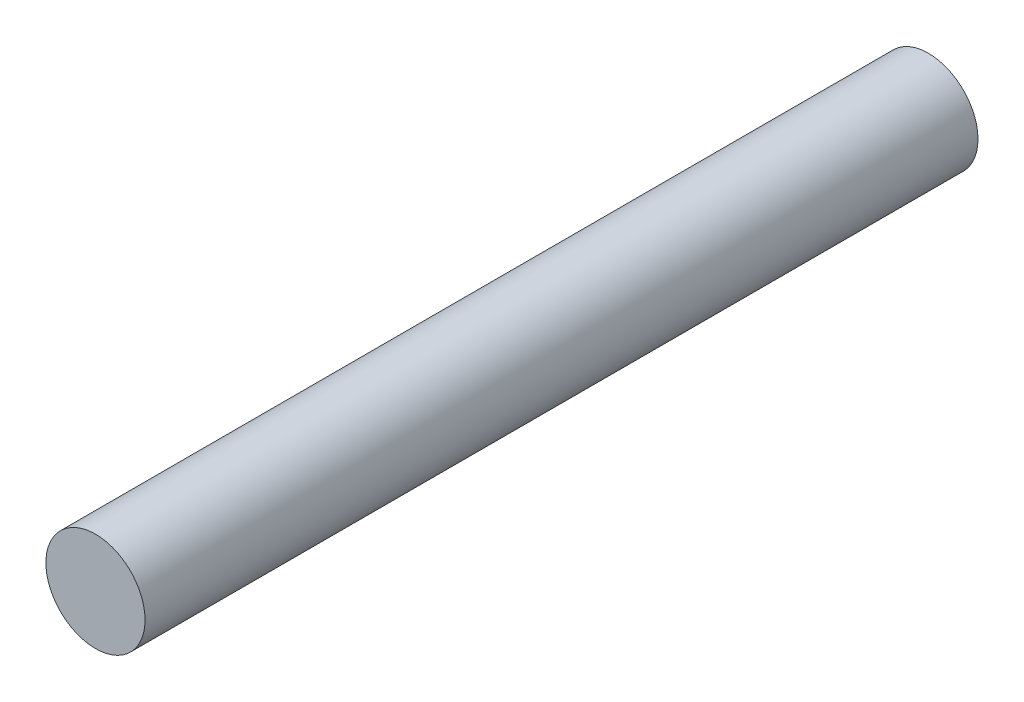
ISO-10303-21;
HEADER;
FILE_DESCRIPTION(('STEP AP214'),'2;1');
FILE_NAME('part.step','',(''),(''),'','','');
FILE_SCHEMA(('AUTOMOTIVE_DESIGN { 1 0 10303 214 1 1 1 1 }'));
ENDSEC;
DATA;
#1=APPLICATION_CONTEXT('core data for automotive mechanical design processes');
#2=APPLICATION_PROTOCOL_DEFINITION('international standard','automotive_design',2000,#1);
#3=PRODUCT_CONTEXT('',#1,'mechanical');
#4=PRODUCT('Part','Part','',(#3));
#5=PRODUCT_RELATED_PRODUCT_CATEGORY('part','',(#4));
#6=PRODUCT_DEFINITION_FORMATION('','',#4);
#7=PRODUCT_DEFINITION_CONTEXT('part definition',#1,'design');
#8=PRODUCT_DEFINITION('design','',#6,#7);
#9=PRODUCT_DEFINITION_SHAPE('','',#8);
#10=(LENGTH_UNIT() NAMED_UNIT(*) SI_UNIT(.MILLI.,.METRE.));
#11=(NAMED_UNIT(*) PLANE_ANGLE_UNIT() SI_UNIT($,.RADIAN.));
#12=(NAMED_UNIT(*) SI_UNIT($,.STERADIAN.) SOLID_ANGLE_UNIT());
#13=UNCERTAINTY_MEASURE_WITH_UNIT(LENGTH_MEASURE(1.E-05),#10,'distance_accuracy_value','');
#14=(GEOMETRIC_REPRESENTATION_CONTEXT(3) GLOBAL_UNCERTAINTY_ASSIGNED_CONTEXT((#13)) GLOBAL_UNIT_ASSIGNED_CONTEXT((#10,
#11,#12)) REPRESENTATION_CONTEXT('',''));
#15=CARTESIAN_POINT('',(0.,0.,0.));
#16=DIRECTION('',(0.,0.,1.));
#17=DIRECTION('',(1.,0.,0.));
#18=AXIS2_PLACEMENT_3D('',#15,#16,#17);
#19=CARTESIAN_POINT('',(0.,0.,25.2));
#20=DIRECTION('',(0.,0.,-1.));
#21=DIRECTION('',(-1.,0.,0.));
#22=AXIS2_PLACEMENT_3D('',#19,#20,#21);
#23=CYLINDRICAL_SURFACE('',#22,1.5);
#24=CARTESIAN_POINT('',(0.,0.,25.2));
#25=DIRECTION('',(0.,0.,1.));
#26=DIRECTION('',(1.,0.,0.));
#27=AXIS2_PLACEMENT_3D('',#24,#25,#26);
#28=CIRCLE('',#27,1.5);
#29=CARTESIAN_POINT('',(1.5,0.,25.2));
#30=VERTEX_POINT('',#29);
#31=EDGE_CURVE('E10',#30,#30,#28,.T.);
#32=ORIENTED_EDGE('',*,*,#31,.F.);
#33=EDGE_LOOP('',(#32));
#34=FACE_BOUND('',#33,.T.);
#35=CARTESIAN_POINT('',(0.,0.,0.));
#36=DIRECTION('',(0.,0.,1.));
#37=DIRECTION('',(1.,0.,0.));
#38=AXIS2_PLACEMENT_3D('',#35,#36,#37);
#39=CIRCLE('',#38,1.5);
#40=CARTESIAN_POINT('',(1.5,0.,0.));
#41=VERTEX_POINT('',#40);
#42=EDGE_CURVE('E47',#41,#41,#39,.T.);
#43=ORIENTED_EDGE('',*,*,#42,.T.);
#44=EDGE_LOOP('',(#43));
#45=FACE_BOUND('',#44,.T.);
#46=ADVANCED_FACE('F44',(#34,#45),#23,.T.);
#47=CARTESIAN_POINT('',(0.,0.,25.2));
#48=DIRECTION('',(0.,0.,1.));
#49=DIRECTION('',(1.,0.,0.));
#50=AXIS2_PLACEMENT_3D('',#47,#48,#49);
#51=PLANE('',#50);
#52=ORIENTED_EDGE('',*,*,#31,.T.);
#53=EDGE_LOOP('',(#52));
#54=FACE_BOUND('',#53,.T.);
#55=ADVANCED_FACE('F61',(#54),#51,.T.);
#56=CARTESIAN_POINT('',(0.,0.,0.));
#57=DIRECTION('',(0.,0.,1.));
#58=DIRECTION('',(1.,0.,0.));
#59=AXIS2_PLACEMENT_3D('',#56,#57,#58);
#60=PLANE('',#59);
#61=ORIENTED_EDGE('',*,*,#42,.F.);
#62=EDGE_LOOP('',(#61));
#63=FACE_BOUND('',#62,.T.);
#64=ADVANCED_FACE('F59',(#63),#60,.F.);
#65=CLOSED_SHELL('',(#46,#55,#64));
#66=MANIFOLD_SOLID_BREP('B2',#65);
#67=ADVANCED_BREP_SHAPE_REPRESENTATION('',(#18,#66),#14);
#68=SHAPE_DEFINITION_REPRESENTATION(#9,#67);
ENDSEC;
END-ISO-10303-21;
